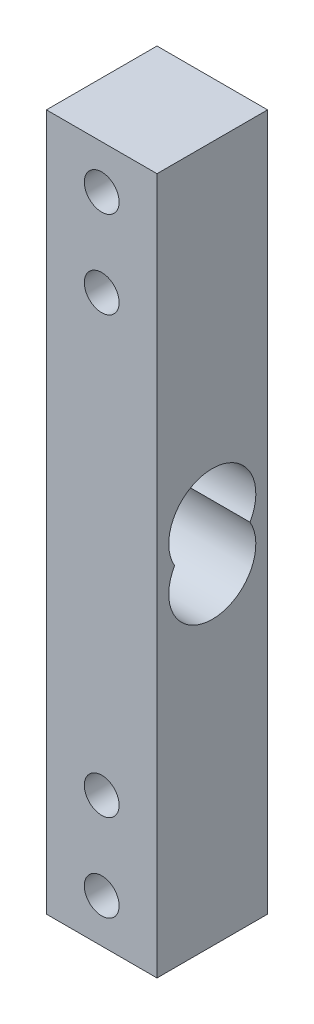
ISO-10303-21;
HEADER;
FILE_DESCRIPTION(('STEP AP214'),'2;1');
FILE_NAME('part.step','',(''),(''),'','','');
FILE_SCHEMA(('AUTOMOTIVE_DESIGN { 1 0 10303 214 1 1 1 1 }'));
ENDSEC;
DATA;
#1=APPLICATION_CONTEXT('core data for automotive mechanical design processes');
#2=APPLICATION_PROTOCOL_DEFINITION('international standard','automotive_design',2000,#1);
#3=PRODUCT_CONTEXT('',#1,'mechanical');
#4=PRODUCT('Part','Part','',(#3));
#5=PRODUCT_RELATED_PRODUCT_CATEGORY('part','',(#4));
#6=PRODUCT_DEFINITION_FORMATION('','',#4);
#7=PRODUCT_DEFINITION_CONTEXT('part definition',#1,'design');
#8=PRODUCT_DEFINITION('design','',#6,#7);
#9=PRODUCT_DEFINITION_SHAPE('','',#8);
#10=(LENGTH_UNIT() NAMED_UNIT(*) SI_UNIT(.MILLI.,.METRE.));
#11=(NAMED_UNIT(*) PLANE_ANGLE_UNIT() SI_UNIT($,.RADIAN.));
#12=(NAMED_UNIT(*) SI_UNIT($,.STERADIAN.) SOLID_ANGLE_UNIT());
#13=UNCERTAINTY_MEASURE_WITH_UNIT(LENGTH_MEASURE(1.E-05),#10,'distance_accuracy_value','');
#14=(GEOMETRIC_REPRESENTATION_CONTEXT(3) GLOBAL_UNCERTAINTY_ASSIGNED_CONTEXT((#13)) GLOBAL_UNIT_ASSIGNED_CONTEXT((#10,
#11,#12)) REPRESENTATION_CONTEXT('',''));
#15=CARTESIAN_POINT('',(0.,0.,0.));
#16=DIRECTION('',(0.,0.,1.));
#17=DIRECTION('',(1.,0.,0.));
#18=AXIS2_PLACEMENT_3D('',#15,#16,#17);
#19=CARTESIAN_POINT('',(0.,80.,0.));
#20=DIRECTION('',(1.,0.,0.));
#21=DIRECTION('',(0.,0.,-1.));
#22=AXIS2_PLACEMENT_3D('',#19,#20,#21);
#23=PLANE('',#22);
#24=CARTESIAN_POINT('',(0.,37.5,6.35));
#25=DIRECTION('',(1.,0.,0.));
#26=DIRECTION('',(0.,0.,-1.));
#27=AXIS2_PLACEMENT_3D('',#24,#25,#26);
#28=CIRCLE('',#27,5.);
#29=CARTESIAN_POINT('',(0.,40.,10.6801270189222));
#30=VERTEX_POINT('',#29);
#31=CARTESIAN_POINT('',(0.,40.,2.01987298107781));
#32=VERTEX_POINT('',#31);
#33=EDGE_CURVE('E86',#30,#32,#28,.T.);
#34=ORIENTED_EDGE('',*,*,#33,.T.);
#35=CARTESIAN_POINT('',(0.,42.5,6.35));
#36=DIRECTION('',(1.,0.,0.));
#37=DIRECTION('',(0.,0.,-1.));
#38=AXIS2_PLACEMENT_3D('',#35,#36,#37);
#39=CIRCLE('',#38,5.);
#40=EDGE_CURVE('E84',#32,#30,#39,.T.);
#41=ORIENTED_EDGE('',*,*,#40,.T.);
#42=EDGE_LOOP('',(#34,#41));
#43=FACE_BOUND('',#42,.T.);
#44=DIRECTION('',(0.,0.,1.));
#45=VECTOR('',#44,1.);
#46=CARTESIAN_POINT('',(0.,0.,0.));
#47=LINE('',#46,#45);
#48=CARTESIAN_POINT('',(0.,0.,0.));
#49=VERTEX_POINT('',#48);
#50=CARTESIAN_POINT('',(0.,0.,12.7));
#51=VERTEX_POINT('',#50);
#52=EDGE_CURVE('E106',#49,#51,#47,.T.);
#53=ORIENTED_EDGE('',*,*,#52,.T.);
#54=DIRECTION('',(0.,-1.,0.));
#55=VECTOR('',#54,1.);
#56=CARTESIAN_POINT('',(0.,80.,12.7));
#57=LINE('',#56,#55);
#58=CARTESIAN_POINT('',(0.,80.,12.7));
#59=VERTEX_POINT('',#58);
#60=EDGE_CURVE('E11',#59,#51,#57,.T.);
#61=ORIENTED_EDGE('',*,*,#60,.F.);
#62=DIRECTION('',(0.,0.,1.));
#63=VECTOR('',#62,1.);
#64=CARTESIAN_POINT('',(0.,80.,0.));
#65=LINE('',#64,#63);
#66=CARTESIAN_POINT('',(0.,80.,0.));
#67=VERTEX_POINT('',#66);
#68=EDGE_CURVE('E107',#67,#59,#65,.T.);
#69=ORIENTED_EDGE('',*,*,#68,.F.);
#70=DIRECTION('',(0.,-1.,0.));
#71=VECTOR('',#70,1.);
#72=CARTESIAN_POINT('',(0.,80.,0.));
#73=LINE('',#72,#71);
#74=EDGE_CURVE('E117',#67,#49,#73,.T.);
#75=ORIENTED_EDGE('',*,*,#74,.T.);
#76=EDGE_LOOP('',(#53,#61,#69,#75));
#77=FACE_BOUND('',#76,.T.);
#78=ADVANCED_FACE('F32',(#43,#77),#23,.F.);
#79=CARTESIAN_POINT('',(0.,80.,12.7));
#80=DIRECTION('',(0.,0.,-1.));
#81=DIRECTION('',(-1.,0.,0.));
#82=AXIS2_PLACEMENT_3D('',#79,#80,#81);
#83=PLANE('',#82);
#84=CARTESIAN_POINT('',(6.34999999999999,5.,12.7));
#85=DIRECTION('',(0.,0.,-1.));
#86=DIRECTION('',(-1.,0.,0.));
#87=AXIS2_PLACEMENT_3D('',#84,#85,#86);
#88=CIRCLE('',#87,2.);
#89=CARTESIAN_POINT('',(4.34999999999999,5.,12.7));
#90=VERTEX_POINT('',#89);
#91=EDGE_CURVE('E96',#90,#90,#88,.T.);
#92=ORIENTED_EDGE('',*,*,#91,.T.);
#93=EDGE_LOOP('',(#92));
#94=FACE_BOUND('',#93,.T.);
#95=CARTESIAN_POINT('',(6.35,65.,12.7));
#96=DIRECTION('',(0.,0.,-1.));
#97=DIRECTION('',(-1.,0.,0.));
#98=AXIS2_PLACEMENT_3D('',#95,#96,#97);
#99=CIRCLE('',#98,2.);
#100=CARTESIAN_POINT('',(4.35,65.,12.7));
#101=VERTEX_POINT('',#100);
#102=EDGE_CURVE('E99',#101,#101,#99,.T.);
#103=ORIENTED_EDGE('',*,*,#102,.T.);
#104=EDGE_LOOP('',(#103));
#105=FACE_BOUND('',#104,.T.);
#106=CARTESIAN_POINT('',(6.35,75.,12.7));
#107=DIRECTION('',(0.,0.,-1.));
#108=DIRECTION('',(-1.,0.,0.));
#109=AXIS2_PLACEMENT_3D('',#106,#107,#108);
#110=CIRCLE('',#109,2.);
#111=CARTESIAN_POINT('',(4.35,75.,12.7));
#112=VERTEX_POINT('',#111);
#113=EDGE_CURVE('E196',#112,#112,#110,.T.);
#114=ORIENTED_EDGE('',*,*,#113,.T.);
#115=EDGE_LOOP('',(#114));
#116=FACE_BOUND('',#115,.T.);
#117=CARTESIAN_POINT('',(6.34999999999999,15.,12.7));
#118=DIRECTION('',(0.,0.,-1.));
#119=DIRECTION('',(-1.,0.,0.));
#120=AXIS2_PLACEMENT_3D('',#117,#118,#119);
#121=CIRCLE('',#120,2.);
#122=CARTESIAN_POINT('',(4.34999999999999,15.,12.7));
#123=VERTEX_POINT('',#122);
#124=EDGE_CURVE('E192',#123,#123,#121,.T.);
#125=ORIENTED_EDGE('',*,*,#124,.T.);
#126=EDGE_LOOP('',(#125));
#127=FACE_BOUND('',#126,.T.);
#128=DIRECTION('',(1.,0.,0.));
#129=VECTOR('',#128,1.);
#130=CARTESIAN_POINT('',(0.,0.,12.7));
#131=LINE('',#130,#129);
#132=CARTESIAN_POINT('',(12.7,0.,12.7));
#133=VERTEX_POINT('',#132);
#134=EDGE_CURVE('E120',#51,#133,#131,.T.);
#135=ORIENTED_EDGE('',*,*,#134,.T.);
#136=DIRECTION('',(0.,-1.,0.));
#137=VECTOR('',#136,1.);
#138=CARTESIAN_POINT('',(12.7,80.,12.7));
#139=LINE('',#138,#137);
#140=CARTESIAN_POINT('',(12.7,80.,12.7));
#141=VERTEX_POINT('',#140);
#142=EDGE_CURVE('E39',#141,#133,#139,.T.);
#143=ORIENTED_EDGE('',*,*,#142,.F.);
#144=DIRECTION('',(1.,0.,0.));
#145=VECTOR('',#144,1.);
#146=CARTESIAN_POINT('',(0.,80.,12.7));
#147=LINE('',#146,#145);
#148=EDGE_CURVE('E110',#59,#141,#147,.T.);
#149=ORIENTED_EDGE('',*,*,#148,.F.);
#150=ORIENTED_EDGE('',*,*,#60,.T.);
#151=EDGE_LOOP('',(#135,#143,#149,#150));
#152=FACE_BOUND('',#151,.T.);
#153=ADVANCED_FACE('F148',(#94,#105,#116,#127,#152),#83,.F.);
#154=CARTESIAN_POINT('',(12.7,80.,0.));
#155=DIRECTION('',(-1.,0.,0.));
#156=DIRECTION('',(0.,0.,1.));
#157=AXIS2_PLACEMENT_3D('',#154,#155,#156);
#158=PLANE('',#157);
#159=CARTESIAN_POINT('',(12.7,37.5,6.34999999999999));
#160=DIRECTION('',(1.,0.,0.));
#161=DIRECTION('',(0.,0.,-1.));
#162=AXIS2_PLACEMENT_3D('',#159,#160,#161);
#163=CIRCLE('',#162,5.);
#164=CARTESIAN_POINT('',(12.7,40.,10.6801270189222));
#165=VERTEX_POINT('',#164);
#166=CARTESIAN_POINT('',(12.7,40.,2.0198729810778));
#167=VERTEX_POINT('',#166);
#168=EDGE_CURVE('E90',#165,#167,#163,.T.);
#169=ORIENTED_EDGE('',*,*,#168,.F.);
#170=CARTESIAN_POINT('',(12.7,42.5,6.34999999999999));
#171=DIRECTION('',(1.,0.,0.));
#172=DIRECTION('',(0.,0.,-1.));
#173=AXIS2_PLACEMENT_3D('',#170,#171,#172);
#174=CIRCLE('',#173,5.);
#175=EDGE_CURVE('E53',#167,#165,#174,.T.);
#176=ORIENTED_EDGE('',*,*,#175,.F.);
#177=EDGE_LOOP('',(#169,#176));
#178=FACE_BOUND('',#177,.T.);
#179=DIRECTION('',(0.,0.,-1.));
#180=VECTOR('',#179,1.);
#181=CARTESIAN_POINT('',(12.7,0.,0.));
#182=LINE('',#181,#180);
#183=CARTESIAN_POINT('',(12.7,0.,0.));
#184=VERTEX_POINT('',#183);
#185=EDGE_CURVE('E122',#133,#184,#182,.T.);
#186=ORIENTED_EDGE('',*,*,#185,.T.);
#187=DIRECTION('',(0.,-1.,0.));
#188=VECTOR('',#187,1.);
#189=CARTESIAN_POINT('',(12.7,80.,0.));
#190=LINE('',#189,#188);
#191=CARTESIAN_POINT('',(12.7,80.,0.));
#192=VERTEX_POINT('',#191);
#193=EDGE_CURVE('E127',#192,#184,#190,.T.);
#194=ORIENTED_EDGE('',*,*,#193,.F.);
#195=DIRECTION('',(0.,0.,-1.));
#196=VECTOR('',#195,1.);
#197=CARTESIAN_POINT('',(12.7,80.,0.));
#198=LINE('',#197,#196);
#199=EDGE_CURVE('E113',#141,#192,#198,.T.);
#200=ORIENTED_EDGE('',*,*,#199,.F.);
#201=ORIENTED_EDGE('',*,*,#142,.T.);
#202=EDGE_LOOP('',(#186,#194,#200,#201));
#203=FACE_BOUND('',#202,.T.);
#204=ADVANCED_FACE('F94',(#178,#203),#158,.F.);
#205=CARTESIAN_POINT('',(0.,80.,0.));
#206=DIRECTION('',(0.,0.,1.));
#207=DIRECTION('',(1.,0.,0.));
#208=AXIS2_PLACEMENT_3D('',#205,#206,#207);
#209=PLANE('',#208);
#210=CARTESIAN_POINT('',(6.34999999999999,5.,0.));
#211=DIRECTION('',(0.,0.,-1.));
#212=DIRECTION('',(-1.,0.,0.));
#213=AXIS2_PLACEMENT_3D('',#210,#211,#212);
#214=CIRCLE('',#213,2.);
#215=CARTESIAN_POINT('',(4.34999999999999,5.,0.));
#216=VERTEX_POINT('',#215);
#217=EDGE_CURVE('E190',#216,#216,#214,.T.);
#218=ORIENTED_EDGE('',*,*,#217,.F.);
#219=EDGE_LOOP('',(#218));
#220=FACE_BOUND('',#219,.T.);
#221=CARTESIAN_POINT('',(6.35,65.,0.));
#222=DIRECTION('',(0.,0.,-1.));
#223=DIRECTION('',(-1.,0.,0.));
#224=AXIS2_PLACEMENT_3D('',#221,#222,#223);
#225=CIRCLE('',#224,2.);
#226=CARTESIAN_POINT('',(4.35,65.,0.));
#227=VERTEX_POINT('',#226);
#228=EDGE_CURVE('E202',#227,#227,#225,.T.);
#229=ORIENTED_EDGE('',*,*,#228,.F.);
#230=EDGE_LOOP('',(#229));
#231=FACE_BOUND('',#230,.T.);
#232=CARTESIAN_POINT('',(6.35,75.,0.));
#233=DIRECTION('',(0.,0.,-1.));
#234=DIRECTION('',(-1.,0.,0.));
#235=AXIS2_PLACEMENT_3D('',#232,#233,#234);
#236=CIRCLE('',#235,2.);
#237=CARTESIAN_POINT('',(4.35,75.,0.));
#238=VERTEX_POINT('',#237);
#239=EDGE_CURVE('E199',#238,#238,#236,.T.);
#240=ORIENTED_EDGE('',*,*,#239,.F.);
#241=EDGE_LOOP('',(#240));
#242=FACE_BOUND('',#241,.T.);
#243=CARTESIAN_POINT('',(6.34999999999999,15.,0.));
#244=DIRECTION('',(0.,0.,-1.));
#245=DIRECTION('',(-1.,0.,0.));
#246=AXIS2_PLACEMENT_3D('',#243,#244,#245);
#247=CIRCLE('',#246,2.);
#248=CARTESIAN_POINT('',(4.34999999999999,15.,0.));
#249=VERTEX_POINT('',#248);
#250=EDGE_CURVE('E193',#249,#249,#247,.T.);
#251=ORIENTED_EDGE('',*,*,#250,.F.);
#252=EDGE_LOOP('',(#251));
#253=FACE_BOUND('',#252,.T.);
#254=DIRECTION('',(-1.,0.,0.));
#255=VECTOR('',#254,1.);
#256=CARTESIAN_POINT('',(0.,0.,0.));
#257=LINE('',#256,#255);
#258=EDGE_CURVE('E111',#184,#49,#257,.T.);
#259=ORIENTED_EDGE('',*,*,#258,.T.);
#260=ORIENTED_EDGE('',*,*,#74,.F.);
#261=DIRECTION('',(-1.,0.,0.));
#262=VECTOR('',#261,1.);
#263=CARTESIAN_POINT('',(0.,80.,0.));
#264=LINE('',#263,#262);
#265=EDGE_CURVE('E115',#192,#67,#264,.T.);
#266=ORIENTED_EDGE('',*,*,#265,.F.);
#267=ORIENTED_EDGE('',*,*,#193,.T.);
#268=EDGE_LOOP('',(#259,#260,#266,#267));
#269=FACE_BOUND('',#268,.T.);
#270=ADVANCED_FACE('F141',(#220,#231,#242,#253,#269),#209,.F.);
#271=CARTESIAN_POINT('',(0.,80.,0.));
#272=DIRECTION('',(0.,1.,0.));
#273=DIRECTION('',(0.,0.,1.));
#274=AXIS2_PLACEMENT_3D('',#271,#272,#273);
#275=PLANE('',#274);
#276=ORIENTED_EDGE('',*,*,#68,.T.);
#277=ORIENTED_EDGE('',*,*,#148,.T.);
#278=ORIENTED_EDGE('',*,*,#199,.T.);
#279=ORIENTED_EDGE('',*,*,#265,.T.);
#280=EDGE_LOOP('',(#276,#277,#278,#279));
#281=FACE_BOUND('',#280,.T.);
#282=ADVANCED_FACE('F147',(#281),#275,.T.);
#283=CARTESIAN_POINT('',(0.,0.,0.));
#284=DIRECTION('',(0.,1.,0.));
#285=DIRECTION('',(0.,0.,1.));
#286=AXIS2_PLACEMENT_3D('',#283,#284,#285);
#287=PLANE('',#286);
#288=ORIENTED_EDGE('',*,*,#52,.F.);
#289=ORIENTED_EDGE('',*,*,#258,.F.);
#290=ORIENTED_EDGE('',*,*,#185,.F.);
#291=ORIENTED_EDGE('',*,*,#134,.F.);
#292=EDGE_LOOP('',(#288,#289,#290,#291));
#293=FACE_BOUND('',#292,.T.);
#294=ADVANCED_FACE('F138',(#293),#287,.F.);
#295=CARTESIAN_POINT('',(-67.3,42.5,6.35000000000001));
#296=DIRECTION('',(1.,0.,0.));
#297=DIRECTION('',(0.,0.,-1.));
#298=AXIS2_PLACEMENT_3D('',#295,#296,#297);
#299=CYLINDRICAL_SURFACE('',#298,5.);
#300=DIRECTION('',(1.,0.,0.));
#301=VECTOR('',#300,1.);
#302=CARTESIAN_POINT('',(-67.3,40.,2.01987298107782));
#303=LINE('',#302,#301);
#304=EDGE_CURVE('E46',#32,#167,#303,.T.);
#305=ORIENTED_EDGE('',*,*,#304,.T.);
#306=ORIENTED_EDGE('',*,*,#175,.T.);
#307=DIRECTION('',(1.,0.,0.));
#308=VECTOR('',#307,1.);
#309=CARTESIAN_POINT('',(-67.3,40.,10.6801270189222));
#310=LINE('',#309,#308);
#311=EDGE_CURVE('E87',#30,#165,#310,.T.);
#312=ORIENTED_EDGE('',*,*,#311,.F.);
#313=ORIENTED_EDGE('',*,*,#40,.F.);
#314=EDGE_LOOP('',(#305,#306,#312,#313));
#315=FACE_BOUND('',#314,.T.);
#316=ADVANCED_FACE('F82',(#315),#299,.F.);
#317=CARTESIAN_POINT('',(-67.3,37.5,6.35000000000001));
#318=DIRECTION('',(1.,0.,0.));
#319=DIRECTION('',(0.,0.,-1.));
#320=AXIS2_PLACEMENT_3D('',#317,#318,#319);
#321=CYLINDRICAL_SURFACE('',#320,5.);
#322=ORIENTED_EDGE('',*,*,#311,.T.);
#323=ORIENTED_EDGE('',*,*,#168,.T.);
#324=ORIENTED_EDGE('',*,*,#304,.F.);
#325=ORIENTED_EDGE('',*,*,#33,.F.);
#326=EDGE_LOOP('',(#322,#323,#324,#325));
#327=FACE_BOUND('',#326,.T.);
#328=ADVANCED_FACE('F91',(#327),#321,.F.);
#329=CARTESIAN_POINT('',(6.34999999999999,15.,80.));
#330=DIRECTION('',(0.,0.,-1.));
#331=DIRECTION('',(-1.,0.,0.));
#332=AXIS2_PLACEMENT_3D('',#329,#330,#331);
#333=CYLINDRICAL_SURFACE('',#332,2.);
#334=ORIENTED_EDGE('',*,*,#250,.T.);
#335=EDGE_LOOP('',(#334));
#336=FACE_BOUND('',#335,.T.);
#337=ORIENTED_EDGE('',*,*,#124,.F.);
#338=EDGE_LOOP('',(#337));
#339=FACE_BOUND('',#338,.T.);
#340=ADVANCED_FACE('F170',(#336,#339),#333,.F.);
#341=CARTESIAN_POINT('',(6.35,75.,80.));
#342=DIRECTION('',(0.,0.,-1.));
#343=DIRECTION('',(-1.,0.,0.));
#344=AXIS2_PLACEMENT_3D('',#341,#342,#343);
#345=CYLINDRICAL_SURFACE('',#344,2.);
#346=ORIENTED_EDGE('',*,*,#239,.T.);
#347=EDGE_LOOP('',(#346));
#348=FACE_BOUND('',#347,.T.);
#349=ORIENTED_EDGE('',*,*,#113,.F.);
#350=EDGE_LOOP('',(#349));
#351=FACE_BOUND('',#350,.T.);
#352=ADVANCED_FACE('F171',(#348,#351),#345,.F.);
#353=CARTESIAN_POINT('',(6.35,65.,80.));
#354=DIRECTION('',(0.,0.,-1.));
#355=DIRECTION('',(-1.,0.,0.));
#356=AXIS2_PLACEMENT_3D('',#353,#354,#355);
#357=CYLINDRICAL_SURFACE('',#356,2.);
#358=ORIENTED_EDGE('',*,*,#228,.T.);
#359=EDGE_LOOP('',(#358));
#360=FACE_BOUND('',#359,.T.);
#361=ORIENTED_EDGE('',*,*,#102,.F.);
#362=EDGE_LOOP('',(#361));
#363=FACE_BOUND('',#362,.T.);
#364=ADVANCED_FACE('F174',(#360,#363),#357,.F.);
#365=CARTESIAN_POINT('',(6.34999999999999,5.,80.));
#366=DIRECTION('',(0.,0.,-1.));
#367=DIRECTION('',(-1.,0.,0.));
#368=AXIS2_PLACEMENT_3D('',#365,#366,#367);
#369=CYLINDRICAL_SURFACE('',#368,2.);
#370=ORIENTED_EDGE('',*,*,#217,.T.);
#371=EDGE_LOOP('',(#370));
#372=FACE_BOUND('',#371,.T.);
#373=ORIENTED_EDGE('',*,*,#91,.F.);
#374=EDGE_LOOP('',(#373));
#375=FACE_BOUND('',#374,.T.);
#376=ADVANCED_FACE('F181',(#372,#375),#369,.F.);
#377=CLOSED_SHELL('',(#78,#153,#204,#270,#282,#294,#316,#328,#340,#352,#364,#376));
#378=MANIFOLD_SOLID_BREP('B2',#377);
#379=ADVANCED_BREP_SHAPE_REPRESENTATION('',(#18,#378),#14);
#380=SHAPE_DEFINITION_REPRESENTATION(#9,#379);
ENDSEC;
END-ISO-10303-21;
